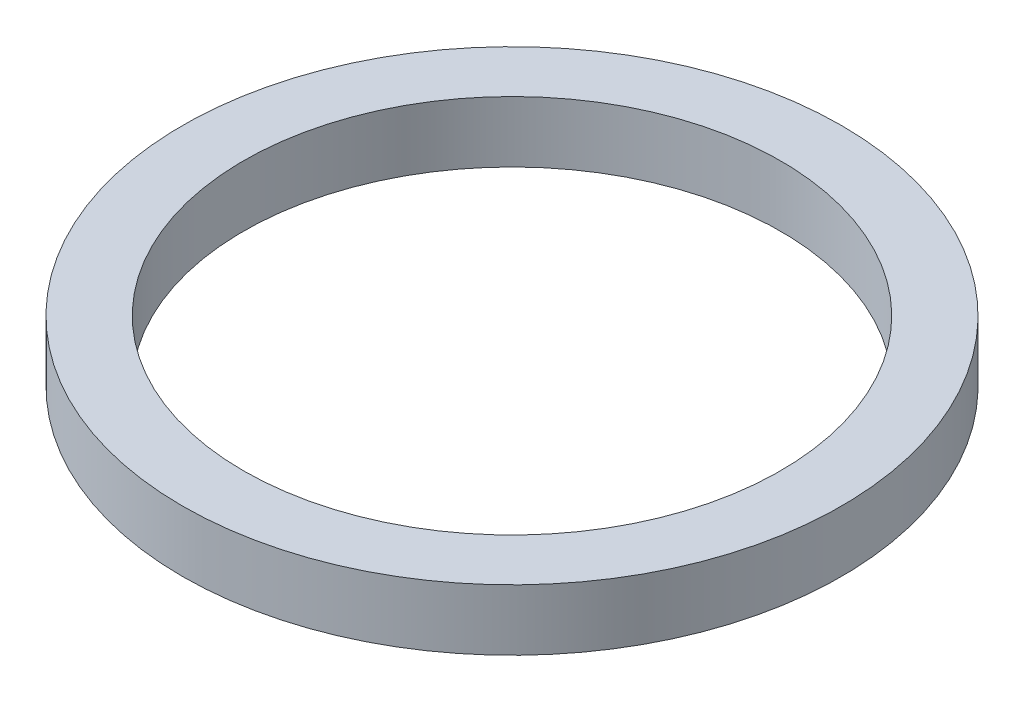
ISO-10303-21;
HEADER;
FILE_DESCRIPTION(('STEP AP214'),'2;1');
FILE_NAME('part.step','',(''),(''),'','','');
FILE_SCHEMA(('AUTOMOTIVE_DESIGN { 1 0 10303 214 1 1 1 1 }'));
ENDSEC;
DATA;
#1=APPLICATION_CONTEXT('core data for automotive mechanical design processes');
#2=APPLICATION_PROTOCOL_DEFINITION('international standard','automotive_design',2000,#1);
#3=PRODUCT_CONTEXT('',#1,'mechanical');
#4=PRODUCT('Part','Part','',(#3));
#5=PRODUCT_RELATED_PRODUCT_CATEGORY('part','',(#4));
#6=PRODUCT_DEFINITION_FORMATION('','',#4);
#7=PRODUCT_DEFINITION_CONTEXT('part definition',#1,'design');
#8=PRODUCT_DEFINITION('design','',#6,#7);
#9=PRODUCT_DEFINITION_SHAPE('','',#8);
#10=(LENGTH_UNIT() NAMED_UNIT(*) SI_UNIT(.MILLI.,.METRE.));
#11=(NAMED_UNIT(*) PLANE_ANGLE_UNIT() SI_UNIT($,.RADIAN.));
#12=(NAMED_UNIT(*) SI_UNIT($,.STERADIAN.) SOLID_ANGLE_UNIT());
#13=UNCERTAINTY_MEASURE_WITH_UNIT(LENGTH_MEASURE(1.E-05),#10,'distance_accuracy_value','');
#14=(GEOMETRIC_REPRESENTATION_CONTEXT(3) GLOBAL_UNCERTAINTY_ASSIGNED_CONTEXT((#13)) GLOBAL_UNIT_ASSIGNED_CONTEXT((#10,
#11,#12)) REPRESENTATION_CONTEXT('',''));
#15=CARTESIAN_POINT('',(0.,0.,0.));
#16=DIRECTION('',(0.,0.,1.));
#17=DIRECTION('',(1.,0.,0.));
#18=AXIS2_PLACEMENT_3D('',#15,#16,#17);
#19=CARTESIAN_POINT('',(0.,2.5,0.));
#20=DIRECTION('',(0.,-1.,0.));
#21=DIRECTION('',(0.,0.,-1.));
#22=AXIS2_PLACEMENT_3D('',#19,#20,#21);
#23=CYLINDRICAL_SURFACE('',#22,22.);
#24=CARTESIAN_POINT('',(0.,2.5,0.));
#25=DIRECTION('',(0.,1.,0.));
#26=DIRECTION('',(0.,0.,1.));
#27=AXIS2_PLACEMENT_3D('',#24,#25,#26);
#28=CIRCLE('',#27,22.);
#29=CARTESIAN_POINT('',(0.,2.5,22.));
#30=VERTEX_POINT('',#29);
#31=EDGE_CURVE('E40',#30,#30,#28,.T.);
#32=ORIENTED_EDGE('',*,*,#31,.T.);
#33=EDGE_LOOP('',(#32));
#34=FACE_BOUND('',#33,.T.);
#35=CARTESIAN_POINT('',(0.,-2.5,0.));
#36=DIRECTION('',(0.,1.,0.));
#37=DIRECTION('',(0.,0.,1.));
#38=AXIS2_PLACEMENT_3D('',#35,#36,#37);
#39=CIRCLE('',#38,22.);
#40=CARTESIAN_POINT('',(0.,-2.5,22.));
#41=VERTEX_POINT('',#40);
#42=EDGE_CURVE('E46',#41,#41,#39,.T.);
#43=ORIENTED_EDGE('',*,*,#42,.F.);
#44=EDGE_LOOP('',(#43));
#45=FACE_BOUND('',#44,.T.);
#46=ADVANCED_FACE('F33',(#34,#45),#23,.F.);
#47=CARTESIAN_POINT('',(0.,2.5,0.));
#48=DIRECTION('',(0.,-1.,0.));
#49=DIRECTION('',(0.,0.,-1.));
#50=AXIS2_PLACEMENT_3D('',#47,#48,#49);
#51=CYLINDRICAL_SURFACE('',#50,27.);
#52=CARTESIAN_POINT('',(0.,2.5,0.));
#53=DIRECTION('',(0.,1.,0.));
#54=DIRECTION('',(0.,0.,1.));
#55=AXIS2_PLACEMENT_3D('',#52,#53,#54);
#56=CIRCLE('',#55,27.);
#57=CARTESIAN_POINT('',(0.,2.5,27.));
#58=VERTEX_POINT('',#57);
#59=EDGE_CURVE('E10',#58,#58,#56,.T.);
#60=ORIENTED_EDGE('',*,*,#59,.F.);
#61=EDGE_LOOP('',(#60));
#62=FACE_BOUND('',#61,.T.);
#63=CARTESIAN_POINT('',(0.,-2.5,0.));
#64=DIRECTION('',(0.,1.,0.));
#65=DIRECTION('',(0.,0.,1.));
#66=AXIS2_PLACEMENT_3D('',#63,#64,#65);
#67=CIRCLE('',#66,27.);
#68=CARTESIAN_POINT('',(0.,-2.5,27.));
#69=VERTEX_POINT('',#68);
#70=EDGE_CURVE('E36',#69,#69,#67,.T.);
#71=ORIENTED_EDGE('',*,*,#70,.T.);
#72=EDGE_LOOP('',(#71));
#73=FACE_BOUND('',#72,.T.);
#74=ADVANCED_FACE('F53',(#62,#73),#51,.T.);
#75=CARTESIAN_POINT('',(0.,2.5,0.));
#76=DIRECTION('',(0.,1.,0.));
#77=DIRECTION('',(0.,0.,1.));
#78=AXIS2_PLACEMENT_3D('',#75,#76,#77);
#79=PLANE('',#78);
#80=ORIENTED_EDGE('',*,*,#31,.F.);
#81=EDGE_LOOP('',(#80));
#82=FACE_BOUND('',#81,.T.);
#83=ORIENTED_EDGE('',*,*,#59,.T.);
#84=EDGE_LOOP('',(#83));
#85=FACE_BOUND('',#84,.T.);
#86=ADVANCED_FACE('F57',(#82,#85),#79,.T.);
#87=CARTESIAN_POINT('',(0.,-2.5,0.));
#88=DIRECTION('',(0.,1.,0.));
#89=DIRECTION('',(0.,0.,1.));
#90=AXIS2_PLACEMENT_3D('',#87,#88,#89);
#91=PLANE('',#90);
#92=ORIENTED_EDGE('',*,*,#42,.T.);
#93=EDGE_LOOP('',(#92));
#94=FACE_BOUND('',#93,.T.);
#95=ORIENTED_EDGE('',*,*,#70,.F.);
#96=EDGE_LOOP('',(#95));
#97=FACE_BOUND('',#96,.T.);
#98=ADVANCED_FACE('F55',(#94,#97),#91,.F.);
#99=CLOSED_SHELL('',(#46,#74,#86,#98));
#100=MANIFOLD_SOLID_BREP('B2',#99);
#101=ADVANCED_BREP_SHAPE_REPRESENTATION('',(#18,#100),#14);
#102=SHAPE_DEFINITION_REPRESENTATION(#9,#101);
ENDSEC;
END-ISO-10303-21;
